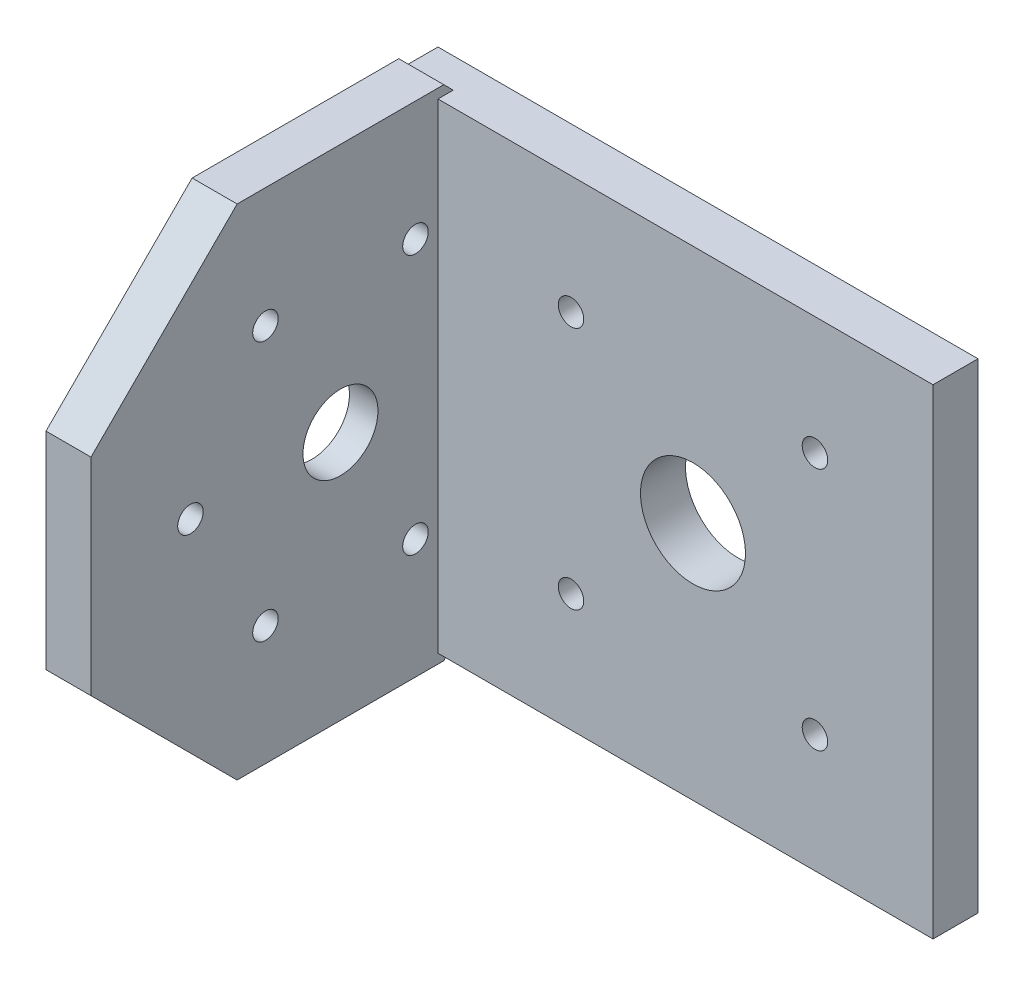
ISO-10303-21;
HEADER;
FILE_DESCRIPTION(('STEP AP214'),'2;1');
FILE_NAME('part.step','',(''),(''),'','','');
FILE_SCHEMA(('AUTOMOTIVE_DESIGN { 1 0 10303 214 1 1 1 1 }'));
ENDSEC;
DATA;
#1=APPLICATION_CONTEXT('core data for automotive mechanical design processes');
#2=APPLICATION_PROTOCOL_DEFINITION('international standard','automotive_design',2000,#1);
#3=PRODUCT_CONTEXT('',#1,'mechanical');
#4=PRODUCT('Part','Part','',(#3));
#5=PRODUCT_RELATED_PRODUCT_CATEGORY('part','',(#4));
#6=PRODUCT_DEFINITION_FORMATION('','',#4);
#7=PRODUCT_DEFINITION_CONTEXT('part definition',#1,'design');
#8=PRODUCT_DEFINITION('design','',#6,#7);
#9=PRODUCT_DEFINITION_SHAPE('','',#8);
#10=(LENGTH_UNIT() NAMED_UNIT(*) SI_UNIT(.MILLI.,.METRE.));
#11=(NAMED_UNIT(*) PLANE_ANGLE_UNIT() SI_UNIT($,.RADIAN.));
#12=(NAMED_UNIT(*) SI_UNIT($,.STERADIAN.) SOLID_ANGLE_UNIT());
#13=UNCERTAINTY_MEASURE_WITH_UNIT(LENGTH_MEASURE(1.E-05),#10,'distance_accuracy_value','');
#14=(GEOMETRIC_REPRESENTATION_CONTEXT(3) GLOBAL_UNCERTAINTY_ASSIGNED_CONTEXT((#13)) GLOBAL_UNIT_ASSIGNED_CONTEXT((#10,
#11,#12)) REPRESENTATION_CONTEXT('',''));
#15=CARTESIAN_POINT('',(0.,0.,0.));
#16=DIRECTION('',(0.,0.,1.));
#17=DIRECTION('',(1.,0.,0.));
#18=AXIS2_PLACEMENT_3D('',#15,#16,#17);
#19=CARTESIAN_POINT('',(-34.,0.,0.));
#20=DIRECTION('',(-1.,0.,0.));
#21=DIRECTION('',(0.,0.,1.));
#22=AXIS2_PLACEMENT_3D('',#19,#20,#21);
#23=PLANE('',#22);
#24=CARTESIAN_POINT('',(-34.,0.,0.));
#25=DIRECTION('',(1.,0.,0.));
#26=DIRECTION('',(0.,0.,-1.));
#27=AXIS2_PLACEMENT_3D('',#24,#25,#26);
#28=CIRCLE('',#27,5.);
#29=CARTESIAN_POINT('',(-34.,0.,-5.));
#30=VERTEX_POINT('',#29);
#31=EDGE_CURVE('E220',#30,#30,#28,.T.);
#32=ORIENTED_EDGE('',*,*,#31,.F.);
#33=EDGE_LOOP('',(#32));
#34=FACE_BOUND('',#33,.T.);
#35=CARTESIAN_POINT('',(-34.,17.3205080756888,-10.));
#36=DIRECTION('',(1.,0.,0.));
#37=DIRECTION('',(0.,0.,-1.));
#38=AXIS2_PLACEMENT_3D('',#35,#36,#37);
#39=CIRCLE('',#38,1.7);
#40=CARTESIAN_POINT('',(-34.,17.3205080756888,-11.7));
#41=VERTEX_POINT('',#40);
#42=EDGE_CURVE('E222',#41,#41,#39,.T.);
#43=ORIENTED_EDGE('',*,*,#42,.F.);
#44=EDGE_LOOP('',(#43));
#45=FACE_BOUND('',#44,.T.);
#46=CARTESIAN_POINT('',(-34.,17.3205080756888,10.));
#47=DIRECTION('',(1.,0.,0.));
#48=DIRECTION('',(0.,0.,-1.));
#49=AXIS2_PLACEMENT_3D('',#46,#47,#48);
#50=CIRCLE('',#49,1.7);
#51=CARTESIAN_POINT('',(-34.,17.3205080756888,8.30000000000001));
#52=VERTEX_POINT('',#51);
#53=EDGE_CURVE('E226',#52,#52,#50,.T.);
#54=ORIENTED_EDGE('',*,*,#53,.F.);
#55=EDGE_LOOP('',(#54));
#56=FACE_BOUND('',#55,.T.);
#57=CARTESIAN_POINT('',(-34.,0.,20.));
#58=DIRECTION('',(1.,0.,0.));
#59=DIRECTION('',(0.,0.,-1.));
#60=AXIS2_PLACEMENT_3D('',#57,#58,#59);
#61=CIRCLE('',#60,1.7);
#62=CARTESIAN_POINT('',(-34.,0.,18.3));
#63=VERTEX_POINT('',#62);
#64=EDGE_CURVE('E234',#63,#63,#61,.T.);
#65=ORIENTED_EDGE('',*,*,#64,.F.);
#66=EDGE_LOOP('',(#65));
#67=FACE_BOUND('',#66,.T.);
#68=CARTESIAN_POINT('',(-34.,-17.3205080756888,9.99999999999999));
#69=DIRECTION('',(1.,0.,0.));
#70=DIRECTION('',(0.,0.,-1.));
#71=AXIS2_PLACEMENT_3D('',#68,#69,#70);
#72=CIRCLE('',#71,1.7);
#73=CARTESIAN_POINT('',(-34.,-17.3205080756888,8.3));
#74=VERTEX_POINT('',#73);
#75=EDGE_CURVE('E239',#74,#74,#72,.T.);
#76=ORIENTED_EDGE('',*,*,#75,.F.);
#77=EDGE_LOOP('',(#76));
#78=FACE_BOUND('',#77,.T.);
#79=CARTESIAN_POINT('',(-34.,-17.3205080756888,-10.));
#80=DIRECTION('',(1.,0.,0.));
#81=DIRECTION('',(0.,0.,-1.));
#82=AXIS2_PLACEMENT_3D('',#79,#80,#81);
#83=CIRCLE('',#82,1.7);
#84=CARTESIAN_POINT('',(-34.,-17.3205080756888,-11.7));
#85=VERTEX_POINT('',#84);
#86=EDGE_CURVE('E242',#85,#85,#83,.T.);
#87=ORIENTED_EDGE('',*,*,#86,.F.);
#88=EDGE_LOOP('',(#87));
#89=FACE_BOUND('',#88,.T.);
#90=DIRECTION('',(0.,0.,-1.));
#91=VECTOR('',#90,1.);
#92=CARTESIAN_POINT('',(-34.,-32.,0.));
#93=LINE('',#92,#91);
#94=CARTESIAN_POINT('',(-34.,-32.,-13.));
#95=VERTEX_POINT('',#94);
#96=CARTESIAN_POINT('',(-34.,-32.,-15.0362667355495));
#97=VERTEX_POINT('',#96);
#98=EDGE_CURVE('E54',#95,#97,#93,.T.);
#99=ORIENTED_EDGE('',*,*,#98,.F.);
#100=DIRECTION('',(0.,-1.,0.));
#101=VECTOR('',#100,1.);
#102=CARTESIAN_POINT('',(-34.,0.,-13.));
#103=LINE('',#102,#101);
#104=CARTESIAN_POINT('',(-34.,32.,-13.));
#105=VERTEX_POINT('',#104);
#106=EDGE_CURVE('E56',#105,#95,#103,.T.);
#107=ORIENTED_EDGE('',*,*,#106,.F.);
#108=DIRECTION('',(0.,0.,1.));
#109=VECTOR('',#108,1.);
#110=CARTESIAN_POINT('',(-34.,32.,0.));
#111=LINE('',#110,#109);
#112=CARTESIAN_POINT('',(-34.,32.,-15.0362667355495));
#113=VERTEX_POINT('',#112);
#114=EDGE_CURVE('E213',#113,#105,#111,.T.);
#115=ORIENTED_EDGE('',*,*,#114,.F.);
#116=DIRECTION('',(0.,0.707106781186548,0.707106781186547));
#117=VECTOR('',#116,1.);
#118=CARTESIAN_POINT('',(-34.,33.2596631704063,-13.7766035651432));
#119=LINE('',#118,#117);
#120=CARTESIAN_POINT('',(-34.,33.2596631704063,-13.7766035651432));
#121=VERTEX_POINT('',#120);
#122=EDGE_CURVE('E264',#113,#121,#119,.T.);
#123=ORIENTED_EDGE('',*,*,#122,.T.);
#124=DIRECTION('',(0.,0.,1.));
#125=VECTOR('',#124,1.);
#126=CARTESIAN_POINT('',(-34.,33.2596631704063,13.7766035651432));
#127=LINE('',#126,#125);
#128=CARTESIAN_POINT('',(-34.,33.2596631704063,13.7766035651432));
#129=VERTEX_POINT('',#128);
#130=EDGE_CURVE('E267',#121,#129,#127,.T.);
#131=ORIENTED_EDGE('',*,*,#130,.T.);
#132=DIRECTION('',(0.,-0.707106781186548,0.707106781186547));
#133=VECTOR('',#132,1.);
#134=CARTESIAN_POINT('',(-34.,13.7766035651432,33.2596631704063));
#135=LINE('',#134,#133);
#136=CARTESIAN_POINT('',(-34.,13.7766035651432,33.2596631704063));
#137=VERTEX_POINT('',#136);
#138=EDGE_CURVE('E271',#129,#137,#135,.T.);
#139=ORIENTED_EDGE('',*,*,#138,.T.);
#140=DIRECTION('',(0.,-1.,0.));
#141=VECTOR('',#140,1.);
#142=CARTESIAN_POINT('',(-34.,-13.7766035651432,33.2596631704063));
#143=LINE('',#142,#141);
#144=CARTESIAN_POINT('',(-34.,-13.7766035651432,33.2596631704063));
#145=VERTEX_POINT('',#144);
#146=EDGE_CURVE('E272',#137,#145,#143,.T.);
#147=ORIENTED_EDGE('',*,*,#146,.T.);
#148=DIRECTION('',(0.,-0.707106781186547,-0.707106781186548));
#149=VECTOR('',#148,1.);
#150=CARTESIAN_POINT('',(-34.,-33.2596631704063,13.7766035651432));
#151=LINE('',#150,#149);
#152=CARTESIAN_POINT('',(-34.,-33.2596631704063,13.7766035651432));
#153=VERTEX_POINT('',#152);
#154=EDGE_CURVE('E274',#145,#153,#151,.T.);
#155=ORIENTED_EDGE('',*,*,#154,.T.);
#156=DIRECTION('',(0.,0.,-1.));
#157=VECTOR('',#156,1.);
#158=CARTESIAN_POINT('',(-34.,-33.2596631704063,-13.7766035651432));
#159=LINE('',#158,#157);
#160=CARTESIAN_POINT('',(-34.,-33.2596631704063,-13.7766035651432));
#161=VERTEX_POINT('',#160);
#162=EDGE_CURVE('E258',#153,#161,#159,.T.);
#163=ORIENTED_EDGE('',*,*,#162,.T.);
#164=DIRECTION('',(0.,0.707106781186547,-0.707106781186548));
#165=VECTOR('',#164,1.);
#166=CARTESIAN_POINT('',(-34.,-13.7766035651432,-33.2596631704063));
#167=LINE('',#166,#165);
#168=EDGE_CURVE('E261',#161,#97,#167,.T.);
#169=ORIENTED_EDGE('',*,*,#168,.T.);
#170=EDGE_LOOP('',(#99,#107,#115,#123,#131,#139,#147,#155,#163,#169));
#171=FACE_BOUND('',#170,.T.);
#172=ADVANCED_FACE('F39',(#34,#45,#56,#67,#78,#89,#171),#23,.F.);
#173=CARTESIAN_POINT('',(-34.,-13.7766035651432,-33.2596631704063));
#174=DIRECTION('',(0.,0.707106781186548,0.707106781186547));
#175=DIRECTION('',(0.,-0.707106781186547,0.707106781186548));
#176=AXIS2_PLACEMENT_3D('',#173,#174,#175);
#177=PLANE('',#176);
#178=DIRECTION('',(-1.,0.,0.));
#179=VECTOR('',#178,1.);
#180=CARTESIAN_POINT('',(-34.,-32.,-15.0362667355495));
#181=LINE('',#180,#179);
#182=CARTESIAN_POINT('',(-40.,-32.,-15.0362667355495));
#183=VERTEX_POINT('',#182);
#184=EDGE_CURVE('E11',#97,#183,#181,.T.);
#185=ORIENTED_EDGE('',*,*,#184,.F.);
#186=ORIENTED_EDGE('',*,*,#168,.F.);
#187=DIRECTION('',(-1.,0.,0.));
#188=VECTOR('',#187,1.);
#189=CARTESIAN_POINT('',(-34.,-33.2596631704063,-13.7766035651432));
#190=LINE('',#189,#188);
#191=CARTESIAN_POINT('',(-40.,-33.2596631704063,-13.7766035651432));
#192=VERTEX_POINT('',#191);
#193=EDGE_CURVE('E312',#161,#192,#190,.T.);
#194=ORIENTED_EDGE('',*,*,#193,.T.);
#195=DIRECTION('',(0.,0.707106781186547,-0.707106781186548));
#196=VECTOR('',#195,1.);
#197=CARTESIAN_POINT('',(-40.,-13.7766035651432,-33.2596631704063));
#198=LINE('',#197,#196);
#199=EDGE_CURVE('E284',#192,#183,#198,.T.);
#200=ORIENTED_EDGE('',*,*,#199,.T.);
#201=EDGE_LOOP('',(#185,#186,#194,#200));
#202=FACE_BOUND('',#201,.T.);
#203=ADVANCED_FACE('F410',(#202),#177,.F.);
#204=CARTESIAN_POINT('',(-34.,33.2596631704063,-13.7766035651432));
#205=DIRECTION('',(0.,-0.707106781186547,0.707106781186548));
#206=DIRECTION('',(0.,-0.707106781186548,-0.707106781186547));
#207=AXIS2_PLACEMENT_3D('',#204,#205,#206);
#208=PLANE('',#207);
#209=DIRECTION('',(1.,0.,0.));
#210=VECTOR('',#209,1.);
#211=CARTESIAN_POINT('',(-34.,32.,-15.0362667355495));
#212=LINE('',#211,#210);
#213=CARTESIAN_POINT('',(-40.,32.,-15.0362667355495));
#214=VERTEX_POINT('',#213);
#215=EDGE_CURVE('E48',#214,#113,#212,.T.);
#216=ORIENTED_EDGE('',*,*,#215,.F.);
#217=DIRECTION('',(0.,0.707106781186548,0.707106781186547));
#218=VECTOR('',#217,1.);
#219=CARTESIAN_POINT('',(-40.,33.2596631704063,-13.7766035651432));
#220=LINE('',#219,#218);
#221=CARTESIAN_POINT('',(-40.,33.2596631704063,-13.7766035651432));
#222=VERTEX_POINT('',#221);
#223=EDGE_CURVE('E282',#214,#222,#220,.T.);
#224=ORIENTED_EDGE('',*,*,#223,.T.);
#225=DIRECTION('',(-1.,0.,0.));
#226=VECTOR('',#225,1.);
#227=CARTESIAN_POINT('',(-34.,33.2596631704063,-13.7766035651432));
#228=LINE('',#227,#226);
#229=EDGE_CURVE('E308',#121,#222,#228,.T.);
#230=ORIENTED_EDGE('',*,*,#229,.F.);
#231=ORIENTED_EDGE('',*,*,#122,.F.);
#232=EDGE_LOOP('',(#216,#224,#230,#231));
#233=FACE_BOUND('',#232,.T.);
#234=ADVANCED_FACE('F332',(#233),#208,.F.);
#235=CARTESIAN_POINT('',(-34.,13.7766035651432,-33.2596631704063));
#236=VERTEX_POINT('',#235);
#237=CARTESIAN_POINT('',(-34.,28.0362667355495,-19.));
#238=VERTEX_POINT('',#237);
#239=EDGE_CURVE('E266',#236,#238,#119,.T.);
#240=ORIENTED_EDGE('',*,*,#239,.T.);
#241=DIRECTION('',(0.,-1.,0.));
#242=VECTOR('',#241,1.);
#243=CARTESIAN_POINT('',(-34.,0.,-19.));
#244=LINE('',#243,#242);
#245=CARTESIAN_POINT('',(-34.,1.37477270848675,-19.));
#246=VERTEX_POINT('',#245);
#247=EDGE_CURVE('E202',#238,#246,#244,.T.);
#248=ORIENTED_EDGE('',*,*,#247,.T.);
#249=CARTESIAN_POINT('',(-34.,0.,-20.));
#250=DIRECTION('',(1.,0.,0.));
#251=DIRECTION('',(0.,0.,-1.));
#252=AXIS2_PLACEMENT_3D('',#249,#250,#251);
#253=CIRCLE('',#252,1.7);
#254=CARTESIAN_POINT('',(-34.,-1.37477270848675,-19.));
#255=VERTEX_POINT('',#254);
#256=EDGE_CURVE('E253',#255,#246,#253,.T.);
#257=ORIENTED_EDGE('',*,*,#256,.F.);
#258=CARTESIAN_POINT('',(-34.,-28.0362667355495,-19.));
#259=VERTEX_POINT('',#258);
#260=EDGE_CURVE('E207',#255,#259,#244,.T.);
#261=ORIENTED_EDGE('',*,*,#260,.T.);
#262=CARTESIAN_POINT('',(-34.,-13.7766035651432,-33.2596631704063));
#263=VERTEX_POINT('',#262);
#264=EDGE_CURVE('E259',#259,#263,#167,.T.);
#265=ORIENTED_EDGE('',*,*,#264,.T.);
#266=DIRECTION('',(0.,1.,0.));
#267=VECTOR('',#266,1.);
#268=CARTESIAN_POINT('',(-34.,13.7766035651432,-33.2596631704063));
#269=LINE('',#268,#267);
#270=EDGE_CURVE('E263',#263,#236,#269,.T.);
#271=ORIENTED_EDGE('',*,*,#270,.T.);
#272=EDGE_LOOP('',(#240,#248,#257,#261,#265,#271));
#273=FACE_BOUND('',#272,.T.);
#274=ADVANCED_FACE('F394',(#273),#23,.F.);
#275=CARTESIAN_POINT('',(-40.,0.,0.));
#276=DIRECTION('',(-1.,0.,0.));
#277=DIRECTION('',(0.,0.,1.));
#278=AXIS2_PLACEMENT_3D('',#275,#276,#277);
#279=PLANE('',#278);
#280=CARTESIAN_POINT('',(-40.,0.,0.));
#281=DIRECTION('',(1.,0.,0.));
#282=DIRECTION('',(0.,0.,-1.));
#283=AXIS2_PLACEMENT_3D('',#280,#281,#282);
#284=CIRCLE('',#283,15.15);
#285=CARTESIAN_POINT('',(-40.,0.,-15.15));
#286=VERTEX_POINT('',#285);
#287=EDGE_CURVE('E490',#286,#286,#284,.T.);
#288=ORIENTED_EDGE('',*,*,#287,.T.);
#289=EDGE_LOOP('',(#288));
#290=FACE_BOUND('',#289,.T.);
#291=CARTESIAN_POINT('',(-40.,0.,-20.));
#292=DIRECTION('',(1.,0.,0.));
#293=DIRECTION('',(0.,0.,-1.));
#294=AXIS2_PLACEMENT_3D('',#291,#292,#293);
#295=CIRCLE('',#294,1.7);
#296=CARTESIAN_POINT('',(-40.,-1.37477270848675,-19.));
#297=VERTEX_POINT('',#296);
#298=CARTESIAN_POINT('',(-40.,1.37477270848675,-19.));
#299=VERTEX_POINT('',#298);
#300=EDGE_CURVE('E249',#297,#299,#295,.T.);
#301=ORIENTED_EDGE('',*,*,#300,.T.);
#302=DIRECTION('',(0.,-1.,0.));
#303=VECTOR('',#302,1.);
#304=CARTESIAN_POINT('',(-40.,-32.,-19.));
#305=LINE('',#304,#303);
#306=EDGE_CURVE('E193',#299,#297,#305,.T.);
#307=ORIENTED_EDGE('',*,*,#306,.T.);
#308=EDGE_LOOP('',(#301,#307));
#309=FACE_BOUND('',#308,.T.);
#310=ORIENTED_EDGE('',*,*,#223,.F.);
#311=DIRECTION('',(0.,0.,-1.));
#312=VECTOR('',#311,1.);
#313=CARTESIAN_POINT('',(-40.,32.,-13.));
#314=LINE('',#313,#312);
#315=CARTESIAN_POINT('',(-40.,32.,-19.));
#316=VERTEX_POINT('',#315);
#317=EDGE_CURVE('E190',#214,#316,#314,.T.);
#318=ORIENTED_EDGE('',*,*,#317,.T.);
#319=CARTESIAN_POINT('',(-40.,28.0362667355495,-19.));
#320=VERTEX_POINT('',#319);
#321=EDGE_CURVE('E195',#316,#320,#305,.T.);
#322=ORIENTED_EDGE('',*,*,#321,.T.);
#323=CARTESIAN_POINT('',(-40.,13.7766035651432,-33.2596631704063));
#324=VERTEX_POINT('',#323);
#325=EDGE_CURVE('E287',#324,#320,#220,.T.);
#326=ORIENTED_EDGE('',*,*,#325,.F.);
#327=DIRECTION('',(0.,1.,0.));
#328=VECTOR('',#327,1.);
#329=CARTESIAN_POINT('',(-40.,13.7766035651432,-33.2596631704063));
#330=LINE('',#329,#328);
#331=CARTESIAN_POINT('',(-40.,-13.7766035651432,-33.2596631704063));
#332=VERTEX_POINT('',#331);
#333=EDGE_CURVE('E285',#332,#324,#330,.T.);
#334=ORIENTED_EDGE('',*,*,#333,.F.);
#335=CARTESIAN_POINT('',(-40.,-28.0362667355495,-19.));
#336=VERTEX_POINT('',#335);
#337=EDGE_CURVE('E278',#336,#332,#198,.T.);
#338=ORIENTED_EDGE('',*,*,#337,.F.);
#339=CARTESIAN_POINT('',(-40.,-32.,-19.));
#340=VERTEX_POINT('',#339);
#341=EDGE_CURVE('E198',#336,#340,#305,.T.);
#342=ORIENTED_EDGE('',*,*,#341,.T.);
#343=DIRECTION('',(0.,0.,-1.));
#344=VECTOR('',#343,1.);
#345=CARTESIAN_POINT('',(-40.,-32.,-13.));
#346=LINE('',#345,#344);
#347=EDGE_CURVE('E178',#183,#340,#346,.T.);
#348=ORIENTED_EDGE('',*,*,#347,.F.);
#349=ORIENTED_EDGE('',*,*,#199,.F.);
#350=DIRECTION('',(0.,0.,-1.));
#351=VECTOR('',#350,1.);
#352=CARTESIAN_POINT('',(-40.,-33.2596631704063,-13.7766035651432));
#353=LINE('',#352,#351);
#354=CARTESIAN_POINT('',(-40.,-33.2596631704063,13.7766035651432));
#355=VERTEX_POINT('',#354);
#356=EDGE_CURVE('E251',#355,#192,#353,.T.);
#357=ORIENTED_EDGE('',*,*,#356,.F.);
#358=DIRECTION('',(0.,-0.707106781186547,-0.707106781186548));
#359=VECTOR('',#358,1.);
#360=CARTESIAN_POINT('',(-40.,-33.2596631704063,13.7766035651432));
#361=LINE('',#360,#359);
#362=CARTESIAN_POINT('',(-40.,-13.7766035651432,33.2596631704063));
#363=VERTEX_POINT('',#362);
#364=EDGE_CURVE('E257',#363,#355,#361,.T.);
#365=ORIENTED_EDGE('',*,*,#364,.F.);
#366=DIRECTION('',(0.,-1.,0.));
#367=VECTOR('',#366,1.);
#368=CARTESIAN_POINT('',(-40.,-13.7766035651432,33.2596631704063));
#369=LINE('',#368,#367);
#370=CARTESIAN_POINT('',(-40.,13.7766035651432,33.2596631704063));
#371=VERTEX_POINT('',#370);
#372=EDGE_CURVE('E295',#371,#363,#369,.T.);
#373=ORIENTED_EDGE('',*,*,#372,.F.);
#374=DIRECTION('',(0.,-0.707106781186548,0.707106781186547));
#375=VECTOR('',#374,1.);
#376=CARTESIAN_POINT('',(-40.,13.7766035651432,33.2596631704063));
#377=LINE('',#376,#375);
#378=CARTESIAN_POINT('',(-40.,33.2596631704063,13.7766035651432));
#379=VERTEX_POINT('',#378);
#380=EDGE_CURVE('E288',#379,#371,#377,.T.);
#381=ORIENTED_EDGE('',*,*,#380,.F.);
#382=DIRECTION('',(0.,0.,1.));
#383=VECTOR('',#382,1.);
#384=CARTESIAN_POINT('',(-40.,33.2596631704063,13.7766035651432));
#385=LINE('',#384,#383);
#386=EDGE_CURVE('E289',#222,#379,#385,.T.);
#387=ORIENTED_EDGE('',*,*,#386,.F.);
#388=EDGE_LOOP('',(#310,#318,#322,#326,#334,#338,#342,#348,#349,#357,#365,#373,#381,#387));
#389=FACE_BOUND('',#388,.T.);
#390=CARTESIAN_POINT('',(-40.,17.3205080756888,10.));
#391=DIRECTION('',(1.,0.,0.));
#392=DIRECTION('',(0.,0.,-1.));
#393=AXIS2_PLACEMENT_3D('',#390,#391,#392);
#394=CIRCLE('',#393,1.7);
#395=CARTESIAN_POINT('',(-40.,17.3205080756888,8.30000000000001));
#396=VERTEX_POINT('',#395);
#397=EDGE_CURVE('E221',#396,#396,#394,.T.);
#398=ORIENTED_EDGE('',*,*,#397,.T.);
#399=EDGE_LOOP('',(#398));
#400=FACE_BOUND('',#399,.T.);
#401=CARTESIAN_POINT('',(-40.,-17.3205080756888,9.99999999999999));
#402=DIRECTION('',(1.,0.,0.));
#403=DIRECTION('',(0.,0.,-1.));
#404=AXIS2_PLACEMENT_3D('',#401,#402,#403);
#405=CIRCLE('',#404,1.7);
#406=CARTESIAN_POINT('',(-40.,-17.3205080756888,8.3));
#407=VERTEX_POINT('',#406);
#408=EDGE_CURVE('E237',#407,#407,#405,.T.);
#409=ORIENTED_EDGE('',*,*,#408,.T.);
#410=EDGE_LOOP('',(#409));
#411=FACE_BOUND('',#410,.T.);
#412=CARTESIAN_POINT('',(-40.,-17.3205080756888,-10.));
#413=DIRECTION('',(1.,0.,0.));
#414=DIRECTION('',(0.,0.,-1.));
#415=AXIS2_PLACEMENT_3D('',#412,#413,#414);
#416=CIRCLE('',#415,1.7);
#417=CARTESIAN_POINT('',(-40.,-17.3205080756888,-11.7));
#418=VERTEX_POINT('',#417);
#419=EDGE_CURVE('E241',#418,#418,#416,.T.);
#420=ORIENTED_EDGE('',*,*,#419,.T.);
#421=EDGE_LOOP('',(#420));
#422=FACE_BOUND('',#421,.T.);
#423=CARTESIAN_POINT('',(-40.,0.,20.));
#424=DIRECTION('',(1.,0.,0.));
#425=DIRECTION('',(0.,0.,-1.));
#426=AXIS2_PLACEMENT_3D('',#423,#424,#425);
#427=CIRCLE('',#426,1.7);
#428=CARTESIAN_POINT('',(-40.,0.,18.3));
#429=VERTEX_POINT('',#428);
#430=EDGE_CURVE('E227',#429,#429,#427,.T.);
#431=ORIENTED_EDGE('',*,*,#430,.T.);
#432=EDGE_LOOP('',(#431));
#433=FACE_BOUND('',#432,.T.);
#434=CARTESIAN_POINT('',(-40.,17.3205080756888,-10.));
#435=DIRECTION('',(1.,0.,0.));
#436=DIRECTION('',(0.,0.,-1.));
#437=AXIS2_PLACEMENT_3D('',#434,#435,#436);
#438=CIRCLE('',#437,1.7);
#439=CARTESIAN_POINT('',(-40.,17.3205080756888,-11.7));
#440=VERTEX_POINT('',#439);
#441=EDGE_CURVE('E219',#440,#440,#438,.T.);
#442=ORIENTED_EDGE('',*,*,#441,.T.);
#443=EDGE_LOOP('',(#442));
#444=FACE_BOUND('',#443,.T.);
#445=ADVANCED_FACE('F333',(#290,#309,#389,#400,#411,#422,#433,#444),#279,.T.);
#446=CARTESIAN_POINT('',(-34.,-33.2596631704063,-13.7766035651432));
#447=DIRECTION('',(0.,1.,0.));
#448=DIRECTION('',(0.,0.,1.));
#449=AXIS2_PLACEMENT_3D('',#446,#447,#448);
#450=PLANE('',#449);
#451=ORIENTED_EDGE('',*,*,#356,.T.);
#452=ORIENTED_EDGE('',*,*,#193,.F.);
#453=ORIENTED_EDGE('',*,*,#162,.F.);
#454=DIRECTION('',(-1.,0.,0.));
#455=VECTOR('',#454,1.);
#456=CARTESIAN_POINT('',(-34.,-33.2596631704063,13.7766035651432));
#457=LINE('',#456,#455);
#458=EDGE_CURVE('E280',#153,#355,#457,.T.);
#459=ORIENTED_EDGE('',*,*,#458,.T.);
#460=EDGE_LOOP('',(#451,#452,#453,#459));
#461=FACE_BOUND('',#460,.T.);
#462=ADVANCED_FACE('F41',(#461),#450,.F.);
#463=ORIENTED_EDGE('',*,*,#264,.F.);
#464=DIRECTION('',(-1.,0.,0.));
#465=VECTOR('',#464,1.);
#466=CARTESIAN_POINT('',(-34.,-28.0362667355495,-19.));
#467=LINE('',#466,#465);
#468=EDGE_CURVE('E211',#259,#336,#467,.T.);
#469=ORIENTED_EDGE('',*,*,#468,.T.);
#470=ORIENTED_EDGE('',*,*,#337,.T.);
#471=DIRECTION('',(-1.,0.,0.));
#472=VECTOR('',#471,1.);
#473=CARTESIAN_POINT('',(-34.,-13.7766035651432,-33.2596631704063));
#474=LINE('',#473,#472);
#475=EDGE_CURVE('E315',#263,#332,#474,.T.);
#476=ORIENTED_EDGE('',*,*,#475,.F.);
#477=EDGE_LOOP('',(#463,#469,#470,#476));
#478=FACE_BOUND('',#477,.T.);
#479=ADVANCED_FACE('F384',(#478),#177,.F.);
#480=CARTESIAN_POINT('',(-34.,13.7766035651432,-33.2596631704063));
#481=DIRECTION('',(0.,0.,1.));
#482=DIRECTION('',(0.,-1.,0.));
#483=AXIS2_PLACEMENT_3D('',#480,#481,#482);
#484=PLANE('',#483);
#485=ORIENTED_EDGE('',*,*,#333,.T.);
#486=DIRECTION('',(-1.,0.,0.));
#487=VECTOR('',#486,1.);
#488=CARTESIAN_POINT('',(-34.,13.7766035651432,-33.2596631704063));
#489=LINE('',#488,#487);
#490=EDGE_CURVE('E310',#236,#324,#489,.T.);
#491=ORIENTED_EDGE('',*,*,#490,.F.);
#492=ORIENTED_EDGE('',*,*,#270,.F.);
#493=ORIENTED_EDGE('',*,*,#475,.T.);
#494=EDGE_LOOP('',(#485,#491,#492,#493));
#495=FACE_BOUND('',#494,.T.);
#496=ADVANCED_FACE('F381',(#495),#484,.F.);
#497=ORIENTED_EDGE('',*,*,#325,.T.);
#498=DIRECTION('',(1.,0.,0.));
#499=VECTOR('',#498,1.);
#500=CARTESIAN_POINT('',(-34.,28.0362667355495,-19.));
#501=LINE('',#500,#499);
#502=EDGE_CURVE('E208',#320,#238,#501,.T.);
#503=ORIENTED_EDGE('',*,*,#502,.T.);
#504=ORIENTED_EDGE('',*,*,#239,.F.);
#505=ORIENTED_EDGE('',*,*,#490,.T.);
#506=EDGE_LOOP('',(#497,#503,#504,#505));
#507=FACE_BOUND('',#506,.T.);
#508=ADVANCED_FACE('F376',(#507),#208,.F.);
#509=CARTESIAN_POINT('',(-34.,33.2596631704063,13.7766035651432));
#510=DIRECTION('',(0.,-1.,0.));
#511=DIRECTION('',(0.,0.,-1.));
#512=AXIS2_PLACEMENT_3D('',#509,#510,#511);
#513=PLANE('',#512);
#514=ORIENTED_EDGE('',*,*,#386,.T.);
#515=DIRECTION('',(-1.,0.,0.));
#516=VECTOR('',#515,1.);
#517=CARTESIAN_POINT('',(-34.,33.2596631704063,13.7766035651432));
#518=LINE('',#517,#516);
#519=EDGE_CURVE('E304',#129,#379,#518,.T.);
#520=ORIENTED_EDGE('',*,*,#519,.F.);
#521=ORIENTED_EDGE('',*,*,#130,.F.);
#522=ORIENTED_EDGE('',*,*,#229,.T.);
#523=EDGE_LOOP('',(#514,#520,#521,#522));
#524=FACE_BOUND('',#523,.T.);
#525=ADVANCED_FACE('F342',(#524),#513,.F.);
#526=CARTESIAN_POINT('',(-34.,13.7766035651432,33.2596631704063));
#527=DIRECTION('',(0.,-0.707106781186547,-0.707106781186548));
#528=DIRECTION('',(0.,0.707106781186548,-0.707106781186547));
#529=AXIS2_PLACEMENT_3D('',#526,#527,#528);
#530=PLANE('',#529);
#531=ORIENTED_EDGE('',*,*,#380,.T.);
#532=DIRECTION('',(-1.,0.,0.));
#533=VECTOR('',#532,1.);
#534=CARTESIAN_POINT('',(-34.,13.7766035651432,33.2596631704063));
#535=LINE('',#534,#533);
#536=EDGE_CURVE('E297',#137,#371,#535,.T.);
#537=ORIENTED_EDGE('',*,*,#536,.F.);
#538=ORIENTED_EDGE('',*,*,#138,.F.);
#539=ORIENTED_EDGE('',*,*,#519,.T.);
#540=EDGE_LOOP('',(#531,#537,#538,#539));
#541=FACE_BOUND('',#540,.T.);
#542=ADVANCED_FACE('F343',(#541),#530,.F.);
#543=CARTESIAN_POINT('',(-34.,-13.7766035651432,33.2596631704063));
#544=DIRECTION('',(0.,0.,-1.));
#545=DIRECTION('',(-1.,0.,0.));
#546=AXIS2_PLACEMENT_3D('',#543,#544,#545);
#547=PLANE('',#546);
#548=ORIENTED_EDGE('',*,*,#372,.T.);
#549=DIRECTION('',(-1.,0.,0.));
#550=VECTOR('',#549,1.);
#551=CARTESIAN_POINT('',(-34.,-13.7766035651432,33.2596631704063));
#552=LINE('',#551,#550);
#553=EDGE_CURVE('E296',#145,#363,#552,.T.);
#554=ORIENTED_EDGE('',*,*,#553,.F.);
#555=ORIENTED_EDGE('',*,*,#146,.F.);
#556=ORIENTED_EDGE('',*,*,#536,.T.);
#557=EDGE_LOOP('',(#548,#554,#555,#556));
#558=FACE_BOUND('',#557,.T.);
#559=ADVANCED_FACE('F351',(#558),#547,.F.);
#560=CARTESIAN_POINT('',(-34.,-33.2596631704063,13.7766035651432));
#561=DIRECTION('',(0.,0.707106781186548,-0.707106781186548));
#562=DIRECTION('',(0.,0.707106781186548,0.707106781186548));
#563=AXIS2_PLACEMENT_3D('',#560,#561,#562);
#564=PLANE('',#563);
#565=ORIENTED_EDGE('',*,*,#364,.T.);
#566=ORIENTED_EDGE('',*,*,#458,.F.);
#567=ORIENTED_EDGE('',*,*,#154,.F.);
#568=ORIENTED_EDGE('',*,*,#553,.T.);
#569=EDGE_LOOP('',(#565,#566,#567,#568));
#570=FACE_BOUND('',#569,.T.);
#571=ADVANCED_FACE('F352',(#570),#564,.F.);
#572=CARTESIAN_POINT('',(-34.,0.,-20.));
#573=DIRECTION('',(-1.,0.,0.));
#574=DIRECTION('',(0.,0.,1.));
#575=AXIS2_PLACEMENT_3D('',#572,#573,#574);
#576=CYLINDRICAL_SURFACE('',#575,1.7);
#577=DIRECTION('',(-1.,0.,0.));
#578=VECTOR('',#577,1.);
#579=CARTESIAN_POINT('',(-34.,-1.37477270848675,-19.));
#580=LINE('',#579,#578);
#581=EDGE_CURVE('E321',#255,#297,#580,.T.);
#582=ORIENTED_EDGE('',*,*,#581,.F.);
#583=ORIENTED_EDGE('',*,*,#256,.T.);
#584=DIRECTION('',(-1.,0.,0.));
#585=VECTOR('',#584,1.);
#586=CARTESIAN_POINT('',(-34.,1.37477270848675,-19.));
#587=LINE('',#586,#585);
#588=EDGE_CURVE('E318',#299,#246,#587,.F.);
#589=ORIENTED_EDGE('',*,*,#588,.F.);
#590=ORIENTED_EDGE('',*,*,#300,.F.);
#591=EDGE_LOOP('',(#582,#583,#589,#590));
#592=FACE_BOUND('',#591,.T.);
#593=ADVANCED_FACE('F395',(#592),#576,.F.);
#594=CARTESIAN_POINT('',(-34.,-17.3205080756888,-10.));
#595=DIRECTION('',(-1.,0.,0.));
#596=DIRECTION('',(0.,0.,1.));
#597=AXIS2_PLACEMENT_3D('',#594,#595,#596);
#598=CYLINDRICAL_SURFACE('',#597,1.7);
#599=ORIENTED_EDGE('',*,*,#86,.T.);
#600=EDGE_LOOP('',(#599));
#601=FACE_BOUND('',#600,.T.);
#602=ORIENTED_EDGE('',*,*,#419,.F.);
#603=EDGE_LOOP('',(#602));
#604=FACE_BOUND('',#603,.T.);
#605=ADVANCED_FACE('F420',(#601,#604),#598,.F.);
#606=CARTESIAN_POINT('',(-34.,-17.3205080756888,9.99999999999999));
#607=DIRECTION('',(-1.,0.,0.));
#608=DIRECTION('',(0.,0.,1.));
#609=AXIS2_PLACEMENT_3D('',#606,#607,#608);
#610=CYLINDRICAL_SURFACE('',#609,1.7);
#611=ORIENTED_EDGE('',*,*,#75,.T.);
#612=EDGE_LOOP('',(#611));
#613=FACE_BOUND('',#612,.T.);
#614=ORIENTED_EDGE('',*,*,#408,.F.);
#615=EDGE_LOOP('',(#614));
#616=FACE_BOUND('',#615,.T.);
#617=ADVANCED_FACE('F425',(#613,#616),#610,.F.);
#618=CARTESIAN_POINT('',(-34.,0.,20.));
#619=DIRECTION('',(-1.,0.,0.));
#620=DIRECTION('',(0.,0.,1.));
#621=AXIS2_PLACEMENT_3D('',#618,#619,#620);
#622=CYLINDRICAL_SURFACE('',#621,1.7);
#623=ORIENTED_EDGE('',*,*,#64,.T.);
#624=EDGE_LOOP('',(#623));
#625=FACE_BOUND('',#624,.T.);
#626=ORIENTED_EDGE('',*,*,#430,.F.);
#627=EDGE_LOOP('',(#626));
#628=FACE_BOUND('',#627,.T.);
#629=ADVANCED_FACE('F426',(#625,#628),#622,.F.);
#630=CARTESIAN_POINT('',(-34.,17.3205080756888,10.));
#631=DIRECTION('',(-1.,0.,0.));
#632=DIRECTION('',(0.,0.,1.));
#633=AXIS2_PLACEMENT_3D('',#630,#631,#632);
#634=CYLINDRICAL_SURFACE('',#633,1.7);
#635=ORIENTED_EDGE('',*,*,#53,.T.);
#636=EDGE_LOOP('',(#635));
#637=FACE_BOUND('',#636,.T.);
#638=ORIENTED_EDGE('',*,*,#397,.F.);
#639=EDGE_LOOP('',(#638));
#640=FACE_BOUND('',#639,.T.);
#641=ADVANCED_FACE('F429',(#637,#640),#634,.F.);
#642=CARTESIAN_POINT('',(-34.,17.3205080756888,-10.));
#643=DIRECTION('',(-1.,0.,0.));
#644=DIRECTION('',(0.,0.,1.));
#645=AXIS2_PLACEMENT_3D('',#642,#643,#644);
#646=CYLINDRICAL_SURFACE('',#645,1.7);
#647=ORIENTED_EDGE('',*,*,#42,.T.);
#648=EDGE_LOOP('',(#647));
#649=FACE_BOUND('',#648,.T.);
#650=ORIENTED_EDGE('',*,*,#441,.F.);
#651=EDGE_LOOP('',(#650));
#652=FACE_BOUND('',#651,.T.);
#653=ADVANCED_FACE('F432',(#649,#652),#646,.F.);
#654=CARTESIAN_POINT('',(-34.,0.,0.));
#655=DIRECTION('',(-1.,0.,0.));
#656=DIRECTION('',(0.,0.,1.));
#657=AXIS2_PLACEMENT_3D('',#654,#655,#656);
#658=CYLINDRICAL_SURFACE('',#657,5.);
#659=CARTESIAN_POINT('',(-37.8,0.,0.));
#660=DIRECTION('',(1.,0.,0.));
#661=DIRECTION('',(0.,0.,-1.));
#662=AXIS2_PLACEMENT_3D('',#659,#660,#661);
#663=CIRCLE('',#662,5.);
#664=CARTESIAN_POINT('',(-37.8,0.,-5.));
#665=VERTEX_POINT('',#664);
#666=EDGE_CURVE('E43',#665,#665,#663,.T.);
#667=ORIENTED_EDGE('',*,*,#666,.F.);
#668=EDGE_LOOP('',(#667));
#669=FACE_BOUND('',#668,.T.);
#670=ORIENTED_EDGE('',*,*,#31,.T.);
#671=EDGE_LOOP('',(#670));
#672=FACE_BOUND('',#671,.T.);
#673=ADVANCED_FACE('F440',(#669,#672),#658,.F.);
#674=CARTESIAN_POINT('',(0.,0.,-13.));
#675=DIRECTION('',(0.,0.,-1.));
#676=DIRECTION('',(-1.,0.,0.));
#677=AXIS2_PLACEMENT_3D('',#674,#675,#676);
#678=PLANE('',#677);
#679=CARTESIAN_POINT('',(16.2634559672906,-16.2634559672906,-13.));
#680=DIRECTION('',(0.,0.,1.));
#681=DIRECTION('',(1.,0.,0.));
#682=AXIS2_PLACEMENT_3D('',#679,#680,#681);
#683=CIRCLE('',#682,1.7);
#684=CARTESIAN_POINT('',(17.9634559672906,-16.2634559672906,-13.));
#685=VERTEX_POINT('',#684);
#686=EDGE_CURVE('E366',#685,#685,#683,.T.);
#687=ORIENTED_EDGE('',*,*,#686,.F.);
#688=EDGE_LOOP('',(#687));
#689=FACE_BOUND('',#688,.T.);
#690=CARTESIAN_POINT('',(-16.2634559672906,-16.2634559672906,-13.));
#691=DIRECTION('',(0.,0.,1.));
#692=DIRECTION('',(1.,0.,0.));
#693=AXIS2_PLACEMENT_3D('',#690,#691,#692);
#694=CIRCLE('',#693,1.7);
#695=CARTESIAN_POINT('',(-14.5634559672906,-16.2634559672906,-13.));
#696=VERTEX_POINT('',#695);
#697=EDGE_CURVE('E508',#696,#696,#694,.T.);
#698=ORIENTED_EDGE('',*,*,#697,.F.);
#699=EDGE_LOOP('',(#698));
#700=FACE_BOUND('',#699,.T.);
#701=CARTESIAN_POINT('',(-16.2634559672906,16.2634559672906,-13.));
#702=DIRECTION('',(0.,0.,1.));
#703=DIRECTION('',(1.,0.,0.));
#704=AXIS2_PLACEMENT_3D('',#701,#702,#703);
#705=CIRCLE('',#704,1.7);
#706=CARTESIAN_POINT('',(-14.5634559672906,16.2634559672906,-13.));
#707=VERTEX_POINT('',#706);
#708=EDGE_CURVE('E503',#707,#707,#705,.T.);
#709=ORIENTED_EDGE('',*,*,#708,.F.);
#710=EDGE_LOOP('',(#709));
#711=FACE_BOUND('',#710,.T.);
#712=CARTESIAN_POINT('',(16.2634559672906,16.2634559672906,-13.));
#713=DIRECTION('',(0.,0.,1.));
#714=DIRECTION('',(1.,0.,0.));
#715=AXIS2_PLACEMENT_3D('',#712,#713,#714);
#716=CIRCLE('',#715,1.7);
#717=CARTESIAN_POINT('',(17.9634559672906,16.2634559672906,-13.));
#718=VERTEX_POINT('',#717);
#719=EDGE_CURVE('E499',#718,#718,#716,.T.);
#720=ORIENTED_EDGE('',*,*,#719,.F.);
#721=EDGE_LOOP('',(#720));
#722=FACE_BOUND('',#721,.T.);
#723=CARTESIAN_POINT('',(0.,0.,-13.));
#724=DIRECTION('',(0.,0.,1.));
#725=DIRECTION('',(1.,0.,0.));
#726=AXIS2_PLACEMENT_3D('',#723,#724,#725);
#727=CIRCLE('',#726,7.);
#728=CARTESIAN_POINT('',(7.,0.,-13.));
#729=VERTEX_POINT('',#728);
#730=EDGE_CURVE('E495',#729,#729,#727,.T.);
#731=ORIENTED_EDGE('',*,*,#730,.F.);
#732=EDGE_LOOP('',(#731));
#733=FACE_BOUND('',#732,.T.);
#734=DIRECTION('',(-1.,0.,0.));
#735=VECTOR('',#734,1.);
#736=CARTESIAN_POINT('',(-40.,32.,-13.));
#737=LINE('',#736,#735);
#738=CARTESIAN_POINT('',(32.,32.,-13.));
#739=VERTEX_POINT('',#738);
#740=EDGE_CURVE('E189',#739,#105,#737,.T.);
#741=ORIENTED_EDGE('',*,*,#740,.T.);
#742=ORIENTED_EDGE('',*,*,#106,.T.);
#743=DIRECTION('',(1.,0.,0.));
#744=VECTOR('',#743,1.);
#745=CARTESIAN_POINT('',(32.,-32.,-13.));
#746=LINE('',#745,#744);
#747=CARTESIAN_POINT('',(32.,-32.,-13.));
#748=VERTEX_POINT('',#747);
#749=EDGE_CURVE('E162',#95,#748,#746,.T.);
#750=ORIENTED_EDGE('',*,*,#749,.T.);
#751=DIRECTION('',(0.,1.,0.));
#752=VECTOR('',#751,1.);
#753=CARTESIAN_POINT('',(32.,32.,-13.));
#754=LINE('',#753,#752);
#755=EDGE_CURVE('E169',#748,#739,#754,.T.);
#756=ORIENTED_EDGE('',*,*,#755,.T.);
#757=EDGE_LOOP('',(#741,#742,#750,#756));
#758=FACE_BOUND('',#757,.T.);
#759=ADVANCED_FACE('F167',(#689,#700,#711,#722,#733,#758),#678,.F.);
#760=CARTESIAN_POINT('',(32.,-32.,-13.));
#761=DIRECTION('',(0.,1.,0.));
#762=DIRECTION('',(0.,0.,1.));
#763=AXIS2_PLACEMENT_3D('',#760,#761,#762);
#764=PLANE('',#763);
#765=ORIENTED_EDGE('',*,*,#749,.F.);
#766=ORIENTED_EDGE('',*,*,#98,.T.);
#767=ORIENTED_EDGE('',*,*,#184,.T.);
#768=ORIENTED_EDGE('',*,*,#347,.T.);
#769=DIRECTION('',(1.,0.,0.));
#770=VECTOR('',#769,1.);
#771=CARTESIAN_POINT('',(32.,-32.,-19.));
#772=LINE('',#771,#770);
#773=CARTESIAN_POINT('',(32.,-32.,-19.));
#774=VERTEX_POINT('',#773);
#775=EDGE_CURVE('E180',#340,#774,#772,.T.);
#776=ORIENTED_EDGE('',*,*,#775,.T.);
#777=DIRECTION('',(0.,0.,-1.));
#778=VECTOR('',#777,1.);
#779=CARTESIAN_POINT('',(32.,-32.,-13.));
#780=LINE('',#779,#778);
#781=EDGE_CURVE('E173',#748,#774,#780,.T.);
#782=ORIENTED_EDGE('',*,*,#781,.F.);
#783=EDGE_LOOP('',(#765,#766,#767,#768,#776,#782));
#784=FACE_BOUND('',#783,.T.);
#785=ADVANCED_FACE('F172',(#784),#764,.F.);
#786=CARTESIAN_POINT('',(-40.,32.,-13.));
#787=DIRECTION('',(0.,-1.,0.));
#788=DIRECTION('',(0.,0.,-1.));
#789=AXIS2_PLACEMENT_3D('',#786,#787,#788);
#790=PLANE('',#789);
#791=ORIENTED_EDGE('',*,*,#215,.T.);
#792=ORIENTED_EDGE('',*,*,#114,.T.);
#793=ORIENTED_EDGE('',*,*,#740,.F.);
#794=DIRECTION('',(0.,0.,-1.));
#795=VECTOR('',#794,1.);
#796=CARTESIAN_POINT('',(32.,32.,-13.));
#797=LINE('',#796,#795);
#798=CARTESIAN_POINT('',(32.,32.,-19.));
#799=VERTEX_POINT('',#798);
#800=EDGE_CURVE('E182',#739,#799,#797,.T.);
#801=ORIENTED_EDGE('',*,*,#800,.T.);
#802=DIRECTION('',(-1.,0.,0.));
#803=VECTOR('',#802,1.);
#804=CARTESIAN_POINT('',(-40.,32.,-19.));
#805=LINE('',#804,#803);
#806=EDGE_CURVE('E174',#799,#316,#805,.T.);
#807=ORIENTED_EDGE('',*,*,#806,.T.);
#808=ORIENTED_EDGE('',*,*,#317,.F.);
#809=EDGE_LOOP('',(#791,#792,#793,#801,#807,#808));
#810=FACE_BOUND('',#809,.T.);
#811=ADVANCED_FACE('F330',(#810),#790,.F.);
#812=CARTESIAN_POINT('',(0.,0.,-19.));
#813=DIRECTION('',(0.,0.,-1.));
#814=DIRECTION('',(-1.,0.,0.));
#815=AXIS2_PLACEMENT_3D('',#812,#813,#814);
#816=PLANE('',#815);
#817=CARTESIAN_POINT('',(16.2634559672906,16.2634559672906,-19.));
#818=DIRECTION('',(0.,0.,1.));
#819=DIRECTION('',(1.,0.,0.));
#820=AXIS2_PLACEMENT_3D('',#817,#818,#819);
#821=CIRCLE('',#820,1.7);
#822=CARTESIAN_POINT('',(17.9634559672906,16.2634559672906,-19.));
#823=VERTEX_POINT('',#822);
#824=EDGE_CURVE('E494',#823,#823,#821,.T.);
#825=ORIENTED_EDGE('',*,*,#824,.T.);
#826=EDGE_LOOP('',(#825));
#827=FACE_BOUND('',#826,.T.);
#828=CARTESIAN_POINT('',(-16.2634559672906,-16.2634559672906,-19.));
#829=DIRECTION('',(0.,0.,1.));
#830=DIRECTION('',(1.,0.,0.));
#831=AXIS2_PLACEMENT_3D('',#828,#829,#830);
#832=CIRCLE('',#831,1.7);
#833=CARTESIAN_POINT('',(-14.5634559672906,-16.2634559672906,-19.));
#834=VERTEX_POINT('',#833);
#835=EDGE_CURVE('E510',#834,#834,#832,.T.);
#836=ORIENTED_EDGE('',*,*,#835,.T.);
#837=EDGE_LOOP('',(#836));
#838=FACE_BOUND('',#837,.T.);
#839=CARTESIAN_POINT('',(16.2634559672906,-16.2634559672906,-19.));
#840=DIRECTION('',(0.,0.,1.));
#841=DIRECTION('',(1.,0.,0.));
#842=AXIS2_PLACEMENT_3D('',#839,#840,#841);
#843=CIRCLE('',#842,1.7);
#844=CARTESIAN_POINT('',(17.9634559672906,-16.2634559672906,-19.));
#845=VERTEX_POINT('',#844);
#846=EDGE_CURVE('E511',#845,#845,#843,.T.);
#847=ORIENTED_EDGE('',*,*,#846,.T.);
#848=EDGE_LOOP('',(#847));
#849=FACE_BOUND('',#848,.T.);
#850=CARTESIAN_POINT('',(-16.2634559672906,16.2634559672906,-19.));
#851=DIRECTION('',(0.,0.,1.));
#852=DIRECTION('',(1.,0.,0.));
#853=AXIS2_PLACEMENT_3D('',#850,#851,#852);
#854=CIRCLE('',#853,1.7);
#855=CARTESIAN_POINT('',(-14.5634559672906,16.2634559672906,-19.));
#856=VERTEX_POINT('',#855);
#857=EDGE_CURVE('E504',#856,#856,#854,.T.);
#858=ORIENTED_EDGE('',*,*,#857,.T.);
#859=EDGE_LOOP('',(#858));
#860=FACE_BOUND('',#859,.T.);
#861=CARTESIAN_POINT('',(0.,0.,-19.));
#862=DIRECTION('',(0.,0.,1.));
#863=DIRECTION('',(1.,0.,0.));
#864=AXIS2_PLACEMENT_3D('',#861,#862,#863);
#865=CIRCLE('',#864,7.);
#866=CARTESIAN_POINT('',(7.,0.,-19.));
#867=VERTEX_POINT('',#866);
#868=EDGE_CURVE('E487',#867,#867,#865,.T.);
#869=ORIENTED_EDGE('',*,*,#868,.T.);
#870=EDGE_LOOP('',(#869));
#871=FACE_BOUND('',#870,.T.);
#872=ORIENTED_EDGE('',*,*,#468,.F.);
#873=ORIENTED_EDGE('',*,*,#260,.F.);
#874=ORIENTED_EDGE('',*,*,#581,.T.);
#875=ORIENTED_EDGE('',*,*,#306,.F.);
#876=ORIENTED_EDGE('',*,*,#588,.T.);
#877=ORIENTED_EDGE('',*,*,#247,.F.);
#878=ORIENTED_EDGE('',*,*,#502,.F.);
#879=ORIENTED_EDGE('',*,*,#321,.F.);
#880=ORIENTED_EDGE('',*,*,#806,.F.);
#881=DIRECTION('',(0.,1.,0.));
#882=VECTOR('',#881,1.);
#883=CARTESIAN_POINT('',(32.,32.,-19.));
#884=LINE('',#883,#882);
#885=EDGE_CURVE('E196',#774,#799,#884,.T.);
#886=ORIENTED_EDGE('',*,*,#885,.F.);
#887=ORIENTED_EDGE('',*,*,#775,.F.);
#888=ORIENTED_EDGE('',*,*,#341,.F.);
#889=EDGE_LOOP('',(#872,#873,#874,#875,#876,#877,#878,#879,#880,#886,#887,#888));
#890=FACE_BOUND('',#889,.T.);
#891=ADVANCED_FACE('F369',(#827,#838,#849,#860,#871,#890),#816,.T.);
#892=CARTESIAN_POINT('',(32.,32.,-13.));
#893=DIRECTION('',(-1.,0.,0.));
#894=DIRECTION('',(0.,0.,1.));
#895=AXIS2_PLACEMENT_3D('',#892,#893,#894);
#896=PLANE('',#895);
#897=ORIENTED_EDGE('',*,*,#885,.T.);
#898=ORIENTED_EDGE('',*,*,#800,.F.);
#899=ORIENTED_EDGE('',*,*,#755,.F.);
#900=ORIENTED_EDGE('',*,*,#781,.T.);
#901=EDGE_LOOP('',(#897,#898,#899,#900));
#902=FACE_BOUND('',#901,.T.);
#903=ADVANCED_FACE('F181',(#902),#896,.F.);
#904=CARTESIAN_POINT('',(16.2634559672906,-16.2634559672906,-13.));
#905=DIRECTION('',(0.,0.,-1.));
#906=DIRECTION('',(-1.,0.,0.));
#907=AXIS2_PLACEMENT_3D('',#904,#905,#906);
#908=CYLINDRICAL_SURFACE('',#907,1.7);
#909=ORIENTED_EDGE('',*,*,#686,.T.);
#910=EDGE_LOOP('',(#909));
#911=FACE_BOUND('',#910,.T.);
#912=ORIENTED_EDGE('',*,*,#846,.F.);
#913=EDGE_LOOP('',(#912));
#914=FACE_BOUND('',#913,.T.);
#915=ADVANCED_FACE('F443',(#911,#914),#908,.F.);
#916=CARTESIAN_POINT('',(-16.2634559672906,-16.2634559672906,-13.));
#917=DIRECTION('',(0.,0.,-1.));
#918=DIRECTION('',(-1.,0.,0.));
#919=AXIS2_PLACEMENT_3D('',#916,#917,#918);
#920=CYLINDRICAL_SURFACE('',#919,1.7);
#921=ORIENTED_EDGE('',*,*,#697,.T.);
#922=EDGE_LOOP('',(#921));
#923=FACE_BOUND('',#922,.T.);
#924=ORIENTED_EDGE('',*,*,#835,.F.);
#925=EDGE_LOOP('',(#924));
#926=FACE_BOUND('',#925,.T.);
#927=ADVANCED_FACE('F457',(#923,#926),#920,.F.);
#928=CARTESIAN_POINT('',(-16.2634559672906,16.2634559672906,-13.));
#929=DIRECTION('',(0.,0.,-1.));
#930=DIRECTION('',(-1.,0.,0.));
#931=AXIS2_PLACEMENT_3D('',#928,#929,#930);
#932=CYLINDRICAL_SURFACE('',#931,1.7);
#933=ORIENTED_EDGE('',*,*,#708,.T.);
#934=EDGE_LOOP('',(#933));
#935=FACE_BOUND('',#934,.T.);
#936=ORIENTED_EDGE('',*,*,#857,.F.);
#937=EDGE_LOOP('',(#936));
#938=FACE_BOUND('',#937,.T.);
#939=ADVANCED_FACE('F458',(#935,#938),#932,.F.);
#940=CARTESIAN_POINT('',(16.2634559672906,16.2634559672906,-13.));
#941=DIRECTION('',(0.,0.,-1.));
#942=DIRECTION('',(-1.,0.,0.));
#943=AXIS2_PLACEMENT_3D('',#940,#941,#942);
#944=CYLINDRICAL_SURFACE('',#943,1.7);
#945=ORIENTED_EDGE('',*,*,#719,.T.);
#946=EDGE_LOOP('',(#945));
#947=FACE_BOUND('',#946,.T.);
#948=ORIENTED_EDGE('',*,*,#824,.F.);
#949=EDGE_LOOP('',(#948));
#950=FACE_BOUND('',#949,.T.);
#951=ADVANCED_FACE('F463',(#947,#950),#944,.F.);
#952=CARTESIAN_POINT('',(0.,0.,-13.));
#953=DIRECTION('',(0.,0.,-1.));
#954=DIRECTION('',(-1.,0.,0.));
#955=AXIS2_PLACEMENT_3D('',#952,#953,#954);
#956=CYLINDRICAL_SURFACE('',#955,7.);
#957=ORIENTED_EDGE('',*,*,#730,.T.);
#958=EDGE_LOOP('',(#957));
#959=FACE_BOUND('',#958,.T.);
#960=ORIENTED_EDGE('',*,*,#868,.F.);
#961=EDGE_LOOP('',(#960));
#962=FACE_BOUND('',#961,.T.);
#963=ADVANCED_FACE('F469',(#959,#962),#956,.F.);
#964=CARTESIAN_POINT('',(-37.8,0.,0.));
#965=DIRECTION('',(-1.,0.,0.));
#966=DIRECTION('',(0.,0.,1.));
#967=AXIS2_PLACEMENT_3D('',#964,#965,#966);
#968=CYLINDRICAL_SURFACE('',#967,15.15);
#969=CARTESIAN_POINT('',(-37.8,0.,0.));
#970=DIRECTION('',(1.,0.,0.));
#971=DIRECTION('',(0.,0.,-1.));
#972=AXIS2_PLACEMENT_3D('',#969,#970,#971);
#973=CIRCLE('',#972,15.15);
#974=CARTESIAN_POINT('',(-37.8,0.,-15.15));
#975=VERTEX_POINT('',#974);
#976=EDGE_CURVE('E486',#975,#975,#973,.T.);
#977=ORIENTED_EDGE('',*,*,#976,.T.);
#978=EDGE_LOOP('',(#977));
#979=FACE_BOUND('',#978,.T.);
#980=ORIENTED_EDGE('',*,*,#287,.F.);
#981=EDGE_LOOP('',(#980));
#982=FACE_BOUND('',#981,.T.);
#983=ADVANCED_FACE('F473',(#979,#982),#968,.F.);
#984=CARTESIAN_POINT('',(-37.8,0.,0.));
#985=DIRECTION('',(1.,0.,0.));
#986=DIRECTION('',(0.,0.,-1.));
#987=AXIS2_PLACEMENT_3D('',#984,#985,#986);
#988=PLANE('',#987);
#989=ORIENTED_EDGE('',*,*,#666,.T.);
#990=EDGE_LOOP('',(#989));
#991=FACE_BOUND('',#990,.T.);
#992=ORIENTED_EDGE('',*,*,#976,.F.);
#993=EDGE_LOOP('',(#992));
#994=FACE_BOUND('',#993,.T.);
#995=ADVANCED_FACE('F474',(#991,#994),#988,.F.);
#996=CLOSED_SHELL('',(#172,#203,#234,#274,#445,#462,#479,#496,#508,#525,#542,#559,#571,#593,
#605,#617,#629,#641,#653,#673,#759,#785,#811,#891,#903,#915,#927,#939,#951,#963,#983,#995));
#997=MANIFOLD_SOLID_BREP('B2',#996);
#998=ADVANCED_BREP_SHAPE_REPRESENTATION('',(#18,#997),#14);
#999=SHAPE_DEFINITION_REPRESENTATION(#9,#998);
ENDSEC;
END-ISO-10303-21;
